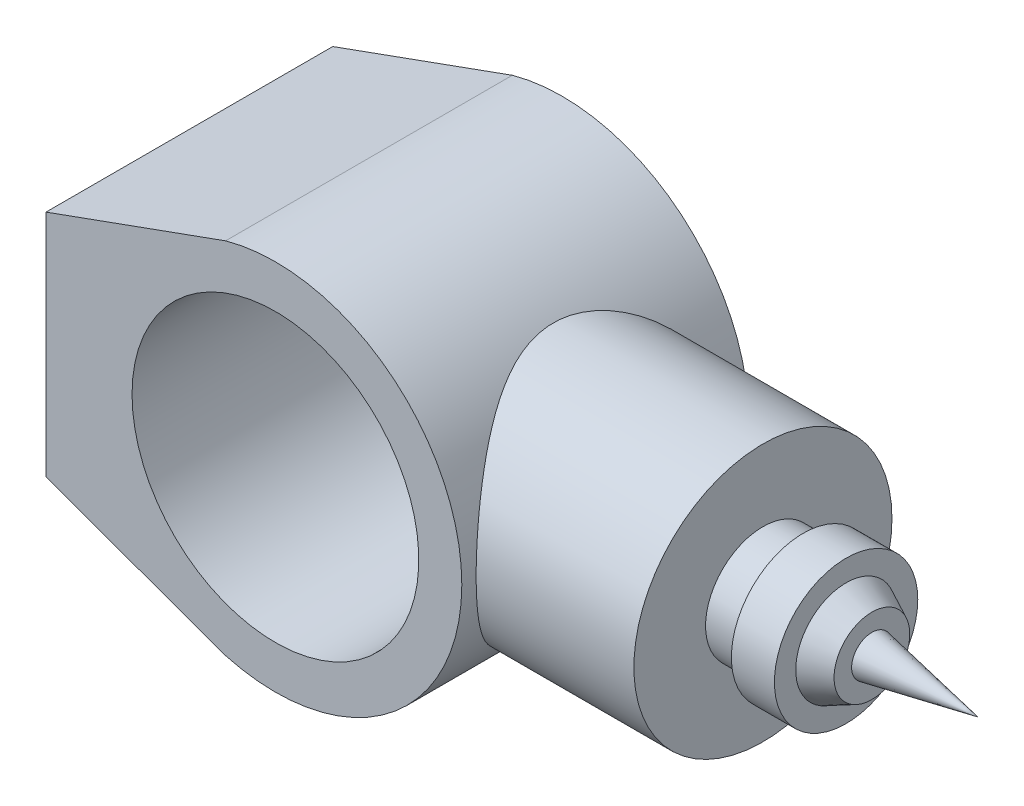
ISO-10303-21;
HEADER;
FILE_DESCRIPTION(('STEP AP214'),'2;1');
FILE_NAME('part.step','',(''),(''),'','','');
FILE_SCHEMA(('AUTOMOTIVE_DESIGN { 1 0 10303 214 1 1 1 1 }'));
ENDSEC;
DATA;
#1=APPLICATION_CONTEXT('core data for automotive mechanical design processes');
#2=APPLICATION_PROTOCOL_DEFINITION('international standard','automotive_design',2000,#1);
#3=PRODUCT_CONTEXT('',#1,'mechanical');
#4=PRODUCT('Part','Part','',(#3));
#5=PRODUCT_RELATED_PRODUCT_CATEGORY('part','',(#4));
#6=PRODUCT_DEFINITION_FORMATION('','',#4);
#7=PRODUCT_DEFINITION_CONTEXT('part definition',#1,'design');
#8=PRODUCT_DEFINITION('design','',#6,#7);
#9=PRODUCT_DEFINITION_SHAPE('','',#8);
#10=(LENGTH_UNIT() NAMED_UNIT(*) SI_UNIT(.MILLI.,.METRE.));
#11=(NAMED_UNIT(*) PLANE_ANGLE_UNIT() SI_UNIT($,.RADIAN.));
#12=(NAMED_UNIT(*) SI_UNIT($,.STERADIAN.) SOLID_ANGLE_UNIT());
#13=UNCERTAINTY_MEASURE_WITH_UNIT(LENGTH_MEASURE(1.E-05),#10,'distance_accuracy_value','');
#14=(GEOMETRIC_REPRESENTATION_CONTEXT(3) GLOBAL_UNCERTAINTY_ASSIGNED_CONTEXT((#13)) GLOBAL_UNIT_ASSIGNED_CONTEXT((#10,
#11,#12)) REPRESENTATION_CONTEXT('',''));
#15=CARTESIAN_POINT('',(0.,0.,0.));
#16=DIRECTION('',(0.,0.,1.));
#17=DIRECTION('',(1.,0.,0.));
#18=AXIS2_PLACEMENT_3D('',#15,#16,#17);
#19=CARTESIAN_POINT('',(0.,0.,50.));
#20=DIRECTION('',(0.,0.,1.));
#21=DIRECTION('',(1.,0.,0.));
#22=AXIS2_PLACEMENT_3D('',#19,#20,#21);
#23=PLANE('',#22);
#24=CARTESIAN_POINT('',(0.,0.,50.));
#25=DIRECTION('',(0.,0.,1.));
#26=DIRECTION('',(1.,0.,0.));
#27=AXIS2_PLACEMENT_3D('',#24,#25,#26);
#28=CIRCLE('',#27,65.);
#29=CARTESIAN_POINT('',(-17.3680727843723,-62.6366509941004,50.));
#30=VERTEX_POINT('',#29);
#31=CARTESIAN_POINT('',(-17.3680727843723,62.6366509941004,50.));
#32=VERTEX_POINT('',#31);
#33=EDGE_CURVE('E208',#30,#32,#28,.T.);
#34=ORIENTED_EDGE('',*,*,#33,.T.);
#35=DIRECTION('',(-0.940460008541162,-0.339904357628374,0.));
#36=VECTOR('',#35,1.);
#37=CARTESIAN_POINT('',(-80.,40.,50.));
#38=LINE('',#37,#36);
#39=CARTESIAN_POINT('',(-80.,40.,50.));
#40=VERTEX_POINT('',#39);
#41=EDGE_CURVE('E97',#32,#40,#38,.T.);
#42=ORIENTED_EDGE('',*,*,#41,.T.);
#43=DIRECTION('',(0.,-1.,0.));
#44=VECTOR('',#43,1.);
#45=CARTESIAN_POINT('',(-80.,-40.,50.));
#46=LINE('',#45,#44);
#47=CARTESIAN_POINT('',(-80.,-40.,50.));
#48=VERTEX_POINT('',#47);
#49=EDGE_CURVE('E204',#40,#48,#46,.T.);
#50=ORIENTED_EDGE('',*,*,#49,.T.);
#51=DIRECTION('',(0.940460008541162,-0.339904357628374,0.));
#52=VECTOR('',#51,1.);
#53=CARTESIAN_POINT('',(-80.,-40.,50.));
#54=LINE('',#53,#52);
#55=EDGE_CURVE('E65',#48,#30,#54,.T.);
#56=ORIENTED_EDGE('',*,*,#55,.T.);
#57=EDGE_LOOP('',(#34,#42,#50,#56));
#58=FACE_BOUND('',#57,.T.);
#59=CARTESIAN_POINT('',(0.,0.,50.));
#60=DIRECTION('',(0.,0.,1.));
#61=DIRECTION('',(1.,0.,0.));
#62=AXIS2_PLACEMENT_3D('',#59,#60,#61);
#63=CIRCLE('',#62,50.);
#64=CARTESIAN_POINT('',(-50.,0.,50.));
#65=VERTEX_POINT('',#64);
#66=EDGE_CURVE('E139',#65,#65,#63,.T.);
#67=ORIENTED_EDGE('',*,*,#66,.F.);
#68=EDGE_LOOP('',(#67));
#69=FACE_BOUND('',#68,.T.);
#70=ADVANCED_FACE('F47',(#58,#69),#23,.T.);
#71=CARTESIAN_POINT('',(0.,0.,-50.));
#72=DIRECTION('',(0.,0.,1.));
#73=DIRECTION('',(1.,0.,0.));
#74=AXIS2_PLACEMENT_3D('',#71,#72,#73);
#75=PLANE('',#74);
#76=CARTESIAN_POINT('',(0.,0.,-50.));
#77=DIRECTION('',(0.,0.,1.));
#78=DIRECTION('',(1.,0.,0.));
#79=AXIS2_PLACEMENT_3D('',#76,#77,#78);
#80=CIRCLE('',#79,65.);
#81=CARTESIAN_POINT('',(-17.3680727843723,-62.6366509941004,-50.));
#82=VERTEX_POINT('',#81);
#83=CARTESIAN_POINT('',(-17.3680727843723,62.6366509941004,-50.));
#84=VERTEX_POINT('',#83);
#85=EDGE_CURVE('E202',#82,#84,#80,.T.);
#86=ORIENTED_EDGE('',*,*,#85,.F.);
#87=DIRECTION('',(0.940460008541162,-0.339904357628374,0.));
#88=VECTOR('',#87,1.);
#89=CARTESIAN_POINT('',(-80.,-40.,-50.));
#90=LINE('',#89,#88);
#91=CARTESIAN_POINT('',(-80.,-40.,-50.));
#92=VERTEX_POINT('',#91);
#93=EDGE_CURVE('E89',#92,#82,#90,.T.);
#94=ORIENTED_EDGE('',*,*,#93,.F.);
#95=DIRECTION('',(0.,-1.,0.));
#96=VECTOR('',#95,1.);
#97=CARTESIAN_POINT('',(-80.,-40.,-50.));
#98=LINE('',#97,#96);
#99=CARTESIAN_POINT('',(-80.,40.,-50.));
#100=VERTEX_POINT('',#99);
#101=EDGE_CURVE('E83',#100,#92,#98,.T.);
#102=ORIENTED_EDGE('',*,*,#101,.F.);
#103=DIRECTION('',(-0.940460008541162,-0.339904357628374,0.));
#104=VECTOR('',#103,1.);
#105=CARTESIAN_POINT('',(-80.,40.,-50.));
#106=LINE('',#105,#104);
#107=EDGE_CURVE('E196',#84,#100,#106,.T.);
#108=ORIENTED_EDGE('',*,*,#107,.F.);
#109=EDGE_LOOP('',(#86,#94,#102,#108));
#110=FACE_BOUND('',#109,.T.);
#111=CARTESIAN_POINT('',(0.,0.,-50.));
#112=DIRECTION('',(0.,0.,1.));
#113=DIRECTION('',(1.,0.,0.));
#114=AXIS2_PLACEMENT_3D('',#111,#112,#113);
#115=CIRCLE('',#114,50.);
#116=CARTESIAN_POINT('',(-50.,0.,-50.));
#117=VERTEX_POINT('',#116);
#118=EDGE_CURVE('E131',#117,#117,#115,.T.);
#119=ORIENTED_EDGE('',*,*,#118,.T.);
#120=EDGE_LOOP('',(#119));
#121=FACE_BOUND('',#120,.T.);
#122=ADVANCED_FACE('F176',(#110,#121),#75,.F.);
#123=CARTESIAN_POINT('',(0.,0.,50.));
#124=DIRECTION('',(0.,0.,-1.));
#125=DIRECTION('',(-1.,0.,0.));
#126=AXIS2_PLACEMENT_3D('',#123,#124,#125);
#127=CYLINDRICAL_SURFACE('',#126,65.);
#128=CARTESIAN_POINT('',(65.,0.,-45.));
#129=CARTESIAN_POINT('',(65.0000011696057,1.12147330120565,-45.0000012025283));
#130=CARTESIAN_POINT('',(64.9709159765213,2.24292945230778,-44.9580201602482));
#131=CARTESIAN_POINT('',(64.8553068641383,4.47658414079082,-44.790785609369));
#132=CARTESIAN_POINT('',(64.7687842573088,5.58878288911931,-44.6655340035371));
#133=CARTESIAN_POINT('',(64.5403785763001,7.79555151848627,-44.3336771879691));
#134=CARTESIAN_POINT('',(64.3984760503456,8.8901150644775,-44.1270433931238));
#135=CARTESIAN_POINT('',(64.0626457436966,11.0533096019768,-43.6354760134034));
#136=CARTESIAN_POINT('',(63.8687169569864,12.1219400915896,-43.3505409144375));
#137=CARTESIAN_POINT('',(63.4342222744662,14.2212125160505,-42.7078017297046));
#138=CARTESIAN_POINT('',(63.1938918545645,15.2520162370063,-42.3503651251477));
#139=CARTESIAN_POINT('',(62.6709259446924,17.2756280115286,-41.5659763086892));
#140=CARTESIAN_POINT('',(62.3882907364915,18.268436318107,-41.1390245597888));
#141=CARTESIAN_POINT('',(61.786108553932,20.2116697228795,-40.2199419970838));
#142=CARTESIAN_POINT('',(61.4665619062631,21.1620951960855,-39.7278117601444));
#143=CARTESIAN_POINT('',(60.7962171584065,23.0172309124314,-38.6825647509799));
#144=CARTESIAN_POINT('',(60.4454175300334,23.9219389167185,-38.1294449962195));
#145=CARTESIAN_POINT('',(59.6865648974474,25.7601880140228,-36.9151737617935));
#146=CARTESIAN_POINT('',(59.27618815402,26.6893215363404,-36.2488040005491));
#147=CARTESIAN_POINT('',(58.4330275057249,28.4880338622967,-34.8529502059224));
#148=CARTESIAN_POINT('',(58.0002425478181,29.3576098626539,-34.1234632053608));
#149=CARTESIAN_POINT('',(57.1195111836477,31.0364486388513,-32.6040251352403));
#150=CARTESIAN_POINT('',(56.6715447181891,31.8456267033451,-31.8139921794123));
#151=CARTESIAN_POINT('',(55.7691986061138,33.4006700551814,-30.1773036556993));
#152=CARTESIAN_POINT('',(55.3148185876119,34.1465316534289,-29.3306447936721));
#153=CARTESIAN_POINT('',(54.3303114345595,35.6959084068904,-27.4326466159468));
#154=CARTESIAN_POINT('',(53.8005937511269,36.4872853280241,-26.3711450656527));
#155=CARTESIAN_POINT('',(52.7593327891933,37.977350950991,-24.17604025639));
#156=CARTESIAN_POINT('',(52.2477941160227,38.6760162868262,-23.0424189272517));
#157=CARTESIAN_POINT('',(51.2608149265043,39.9749077721744,-20.7072341856928));
#158=CARTESIAN_POINT('',(50.7853275075273,40.5752630453964,-19.5057627267967));
#159=CARTESIAN_POINT('',(49.8892399163793,41.6721166930025,-17.0369318640641));
#160=CARTESIAN_POINT('',(49.4686114171659,42.1686687478853,-15.7696069409943));
#161=CARTESIAN_POINT('',(48.8208029416879,42.9149535309565,-13.5723996352816));
#162=CARTESIAN_POINT('',(48.5738420263558,43.1936925213245,-12.6581208440976));
#163=CARTESIAN_POINT('',(48.1238801744123,43.6944569649788,-10.8035389223551));
#164=CARTESIAN_POINT('',(47.9208721021929,43.9164916250901,-9.86324004407422));
#165=CARTESIAN_POINT('',(47.5660754926548,44.3005296261305,-7.96250438663412));
#166=CARTESIAN_POINT('',(47.4142038087044,44.4626304606427,-7.0021030214949));
#167=CARTESIAN_POINT('',(47.1671263845177,44.7246555122386,-5.0655405262852));
#168=CARTESIAN_POINT('',(47.0719206259529,44.824579749433,-4.08937940131227));
#169=CARTESIAN_POINT('',(46.9418899090943,44.9607388198673,-2.12323648479673));
#170=CARTESIAN_POINT('',(46.9073939345417,44.9966266570423,-1.13320851844661));
#171=CARTESIAN_POINT('',(46.9013571135476,45.0029190462422,0.847248377093815));
#172=CARTESIAN_POINT('',(46.9298161498631,44.9733237202183,1.83767730553397));
#173=CARTESIAN_POINT('',(47.0484302849821,44.8492190899201,3.81128752429079));
#174=CARTESIAN_POINT('',(47.1386230552101,44.7546701492421,4.79446401850659));
#175=CARTESIAN_POINT('',(47.3768313176079,44.5024241630868,6.74551496467454));
#176=CARTESIAN_POINT('',(47.5248480621437,44.3447257499009,7.71338908473166));
#177=CARTESIAN_POINT('',(47.8621764271841,43.9803320764262,9.56919366964683));
#178=CARTESIAN_POINT('',(48.0484149088864,43.7772163066585,10.4583970625519));
#179=CARTESIAN_POINT('',(48.4609441046406,43.32010640119,12.2144143492181));
#180=CARTESIAN_POINT('',(48.6872496045115,43.0660934784815,13.0812198417583));
#181=CARTESIAN_POINT('',(49.1738509640383,42.5096331932465,14.7898225666927));
#182=CARTESIAN_POINT('',(49.4341648638834,42.2071601049958,15.6316062329481));
#183=CARTESIAN_POINT('',(49.9825182796335,41.5563350032134,17.2876417419013));
#184=CARTESIAN_POINT('',(50.2705534011697,41.2079902580444,18.1018979206948));
#185=CARTESIAN_POINT('',(51.0225431471345,40.2767822129268,20.1137766396802));
#186=CARTESIAN_POINT('',(51.5007434523328,39.6654891440572,21.2930273345177));
#187=CARTESIAN_POINT('',(52.4891158781477,38.348029920852,23.5833678403921));
#188=CARTESIAN_POINT('',(52.9993005340588,37.6418264436726,24.6944305853524));
#189=CARTESIAN_POINT('',(54.0361557973494,36.1376496350166,26.8476775780095));
#190=CARTESIAN_POINT('',(54.5628535785461,35.3395185623559,27.8897384505711));
#191=CARTESIAN_POINT('',(55.6171804467178,33.6558443419671,29.8998791095632));
#192=CARTESIAN_POINT('',(56.1448094104418,32.7703120184234,30.8679680307498));
#193=CARTESIAN_POINT('',(57.1932449701135,30.9045304086319,32.7363921475659));
#194=CARTESIAN_POINT('',(57.7139191350982,29.9233731295192,33.6358963165067));
#195=CARTESIAN_POINT('',(58.7296419536465,27.8771206485979,35.350355349792));
#196=CARTESIAN_POINT('',(59.2246882700661,26.8120178135979,36.1653025097018));
#197=CARTESIAN_POINT('',(60.1756566955639,24.6035209522421,37.7024332048813));
#198=CARTESIAN_POINT('',(60.6316475651595,23.4602711709794,38.4247809320632));
#199=CARTESIAN_POINT('',(61.4931891608211,21.0989507187335,39.7703323765769));
#200=CARTESIAN_POINT('',(61.898755017873,19.8809026570889,40.3935658507715));
#201=CARTESIAN_POINT('',(62.5646802947783,17.6549035875762,41.4059204565395));
#202=CARTESIAN_POINT('',(62.8372982548467,16.6602403417733,41.8163120535009));
#203=CARTESIAN_POINT('',(63.3397164077328,14.6345031625144,42.5675669112335));
#204=CARTESIAN_POINT('',(63.569522535998,13.603434299959,42.9084398107234));
#205=CARTESIAN_POINT('',(63.9815049902596,11.5110112910016,43.5164676119118));
#206=CARTESIAN_POINT('',(64.1637052650743,10.4496726714622,43.7836595836378));
#207=CARTESIAN_POINT('',(64.476639865795,8.30296993183374,44.2409869387356));
#208=CARTESIAN_POINT('',(64.6073730982257,7.21760530180256,44.431120684921));
#209=CARTESIAN_POINT('',(64.8147345736682,5.02649787175023,44.7321113931983));
#210=CARTESIAN_POINT('',(64.8911534961694,3.92069290489762,44.8426616714377));
#211=CARTESIAN_POINT('',(64.9872183357685,1.70145350776207,44.981563734156));
#212=CARTESIAN_POINT('',(65.0068642771874,0.58801908074768,45.0099155538474));
#213=CARTESIAN_POINT('',(64.9889001241945,-1.63741781931567,44.9839662509349));
#214=CARTESIAN_POINT('',(64.9512898349751,-2.74942028747967,44.929664847113));
#215=CARTESIAN_POINT('',(64.819734418053,-4.96298947367602,44.7392747901952));
#216=CARTESIAN_POINT('',(64.7257910494465,-6.06455651648126,44.6031886909653));
#217=CARTESIAN_POINT('',(64.491175703309,-8.18254449212148,44.2620157992034));
#218=CARTESIAN_POINT('',(64.3536808680178,-9.20007959997773,44.0616107864454));
#219=CARTESIAN_POINT('',(64.0337856060908,-11.2121337136589,43.593061351668));
#220=CARTESIAN_POINT('',(63.8513873855499,-12.2066538475799,43.3249202574929));
#221=CARTESIAN_POINT('',(63.4451725249075,-14.1673074608522,42.7239854011605));
#222=CARTESIAN_POINT('',(63.2213525684632,-15.1334386601222,42.3911864622048));
#223=CARTESIAN_POINT('',(62.7363363526771,-17.0327019487273,41.6643868113869));
#224=CARTESIAN_POINT('',(62.4751380044848,-17.965832190203,41.2703826790343));
#225=CARTESIAN_POINT('',(61.8990085085122,-19.8637431772395,40.3931275129008));
#226=CARTESIAN_POINT('',(61.5815209528501,-20.8256806929253,39.9054081529014));
#227=CARTESIAN_POINT('',(60.9142086391395,-22.7035764997345,38.8677076181211));
#228=CARTESIAN_POINT('',(60.5643826081083,-23.6195329786528,38.3177239921568));
#229=CARTESIAN_POINT('',(59.8381347129401,-25.4032558353403,37.1592008079418));
#230=CARTESIAN_POINT('',(59.4616987975441,-26.270996314329,36.5506302507532));
#231=CARTESIAN_POINT('',(58.6884577670336,-27.9557544991496,35.2787474176625));
#232=CARTESIAN_POINT('',(58.2916515549571,-28.7727694681138,34.615432192531));
#233=CARTESIAN_POINT('',(57.4151711853793,-30.4889708749912,33.1199200847161));
#234=CARTESIAN_POINT('',(56.9328754552547,-31.3785212006928,32.2781812569548));
#235=CARTESIAN_POINT('',(55.9590893109094,-33.0839042215169,30.527835244559));
#236=CARTESIAN_POINT('',(55.4675975421249,-33.8997259516808,29.61921815009));
#237=CARTESIAN_POINT('',(54.4860350387397,-35.45586994741,27.7375714933992));
#238=CARTESIAN_POINT('',(53.9959654596117,-36.1961418986443,26.7644997080007));
#239=CARTESIAN_POINT('',(53.0294834997435,-37.5978502361011,24.7568233036382));
#240=CARTESIAN_POINT('',(52.553069328415,-38.2592969946585,23.7222268074148));
#241=CARTESIAN_POINT('',(51.679941347726,-39.4291013564639,21.7149007388747));
#242=CARTESIAN_POINT('',(51.2803372484816,-39.9463152685162,20.7485884228094));
#243=CARTESIAN_POINT('',(50.5123974548912,-40.913063666173,18.7705314851885));
#244=CARTESIAN_POINT('',(50.1440619804653,-41.3625976757848,17.7587865441704));
#245=CARTESIAN_POINT('',(49.4504928922364,-42.189330129269,15.693797265063));
#246=CARTESIAN_POINT('',(49.1251906412472,-42.566644202947,14.6406225749502));
#247=CARTESIAN_POINT('',(48.5290098021012,-43.2451098617227,12.4950157035289));
#248=CARTESIAN_POINT('',(48.2581179989952,-43.5462799449171,11.4025931307277));
#249=CARTESIAN_POINT('',(47.8271610412375,-44.018687486118,9.39216299943509));
#250=CARTESIAN_POINT('',(47.6558419905218,-44.2036946073207,8.47979353570418));
#251=CARTESIAN_POINT('',(47.3627606953031,-44.517583244497,6.63757582668244));
#252=CARTESIAN_POINT('',(47.2409923142224,-44.6464717105955,5.70772976070372));
#253=CARTESIAN_POINT('',(47.05166615705,-44.8459556683364,3.83718735816971));
#254=CARTESIAN_POINT('',(46.9840561376509,-44.9166073394187,2.89650236820513));
#255=CARTESIAN_POINT('',(46.9055698265682,-44.9985645522097,1.01014116515034));
#256=CARTESIAN_POINT('',(46.8946943314281,-45.0098692606967,0.0644648821697801));
#257=CARTESIAN_POINT('',(46.9301408777119,-44.972908524549,-1.82506201386805));
#258=CARTESIAN_POINT('',(46.9764888551696,-44.9246160680299,-2.76891160474201));
#259=CARTESIAN_POINT('',(47.1245232303033,-44.7693052695385,-4.64731891289863));
#260=CARTESIAN_POINT('',(47.226209296244,-44.6622872796082,-5.58187668584875));
#261=CARTESIAN_POINT('',(47.4811423262629,-44.3911660407895,-7.43666598606561));
#262=CARTESIAN_POINT('',(47.634452919394,-44.2269923369625,-8.35687836049679));
#263=CARTESIAN_POINT('',(47.9871889035597,-43.8440109221367,-10.1768310643423));
#264=CARTESIAN_POINT('',(48.1866204648689,-43.6251959006593,-11.0765686368372));
#265=CARTESIAN_POINT('',(48.6908782922366,-43.0625185245671,-13.116726178063));
#266=CARTESIAN_POINT('',(49.0093972350599,-42.7008255731353,-14.2488681052183));
#267=CARTESIAN_POINT('',(49.699554494161,-41.8955268796886,-16.4668795226373));
#268=CARTESIAN_POINT('',(50.0712093704162,-41.4518955887103,-17.5527344499461));
#269=CARTESIAN_POINT('',(50.8544123719762,-40.4872212981013,-19.6760329984318));
#270=CARTESIAN_POINT('',(51.2660067549033,-39.9660881554129,-20.7134183727638));
#271=CARTESIAN_POINT('',(52.116211879306,-38.8508952329155,-22.7363587217865));
#272=CARTESIAN_POINT('',(52.5548209260535,-38.2568400254561,-23.7219169406072));
#273=CARTESIAN_POINT('',(53.4579357785502,-36.9847423381263,-25.6613286822633));
#274=CARTESIAN_POINT('',(53.9228021101371,-36.3051118639051,-26.6139712103077));
#275=CARTESIAN_POINT('',(54.8583333343946,-34.8753950985048,-28.4617532840731));
#276=CARTESIAN_POINT('',(55.3289982185488,-34.1253089107936,-29.3568929142368));
#277=CARTESIAN_POINT('',(56.2664339133503,-32.5564691651912,-31.0876310121466));
#278=CARTESIAN_POINT('',(56.733203509343,-31.7376950080828,-31.923211478402));
#279=CARTESIAN_POINT('',(57.6535165855435,-30.0334816520249,-33.5315189390535));
#280=CARTESIAN_POINT('',(58.1070588196762,-29.1480362003111,-34.3042400240122));
#281=CARTESIAN_POINT('',(59.0635284336244,-27.1643113596245,-35.9022819462667));
#282=CARTESIAN_POINT('',(59.5626106290919,-26.0547472869609,-36.7159606163357));
#283=CARTESIAN_POINT('',(60.5176757229357,-23.7521280348397,-38.2458641369291));
#284=CARTESIAN_POINT('',(60.9736519283074,-22.5590599397197,-38.962073861155));
#285=CARTESIAN_POINT('',(61.6149926579414,-20.712734812731,-39.9558623322098));
#286=CARTESIAN_POINT('',(61.8215919655179,-20.0881105839989,-40.2735888165198));
#287=CARTESIAN_POINT('',(62.2191547005857,-18.8206694867555,-40.8812436548858));
#288=CARTESIAN_POINT('',(62.4101203779566,-18.1778552539996,-41.1711760099035));
#289=CARTESIAN_POINT('',(62.7748527233683,-16.8752831176649,-41.7219931318357));
#290=CARTESIAN_POINT('',(62.9486230408552,-16.2155288469421,-41.9828840638124));
#291=CARTESIAN_POINT('',(63.2775356475737,-14.8804011558233,-42.4744610119283));
#292=CARTESIAN_POINT('',(63.432679284421,-14.2050288695917,-42.7051492133046));
#293=CARTESIAN_POINT('',(63.8070721968101,-12.4447010544915,-43.25974494481));
#294=CARTESIAN_POINT('',(64.0114184468014,-11.3490405228654,-43.5602757498286));
#295=CARTESIAN_POINT('',(64.3654191982087,-9.12991345978798,-44.0788276443961));
#296=CARTESIAN_POINT('',(64.5150820049425,-8.00645117856253,-44.2968612637911));
#297=CARTESIAN_POINT('',(64.7559993187061,-5.74082253729109,-44.6470112993716));
#298=CARTESIAN_POINT('',(64.847297757104,-4.59867091062171,-44.7791923387443));
#299=CARTESIAN_POINT('',(64.9692976296881,-2.30434018473195,-44.9556862638234));
#300=CARTESIAN_POINT('',(64.9999987983896,-1.15216104160189,-44.999998764566));
#301=CARTESIAN_POINT('',(65.,0.,-45.));
#302=B_SPLINE_CURVE_WITH_KNOTS('',3,(#128,#129,#130,#131,#132,#133,#134,#135,#136,#137,#138,
#139,#140,#141,#142,#143,#144,#145,#146,#147,#148,#149,#150,#151,#152,#153,#154,#155,#156,#157,
#158,#159,#160,#161,#162,#163,#164,#165,#166,#167,#168,#169,#170,#171,#172,#173,#174,#175,#176,
#177,#178,#179,#180,#181,#182,#183,#184,#185,#186,#187,#188,#189,#190,#191,#192,#193,#194,#195,
#196,#197,#198,#199,#200,#201,#202,#203,#204,#205,#206,#207,#208,#209,#210,#211,#212,#213,#214,
#215,#216,#217,#218,#219,#220,#221,#222,#223,#224,#225,#226,#227,#228,#229,#230,#231,#232,#233,
#234,#235,#236,#237,#238,#239,#240,#241,#242,#243,#244,#245,#246,#247,#248,#249,#250,#251,#252,
#253,#254,#255,#256,#257,#258,#259,#260,#261,#262,#263,#264,#265,#266,#267,#268,#269,#270,#271,
#272,#273,#274,#275,#276,#277,#278,#279,#280,#281,#282,#283,#284,#285,#286,#287,#288,#289,#290,
#291,#292,#293,#294,#295,#296,#297,#298,#299,#300,#301),.UNSPECIFIED.,.T.,.F.,(4,2,2,2,2,2,2,2,
2,2,2,2,2,2,2,2,2,2,2,2,2,2,2,2,2,2,2,2,2,2,2,2,2,2,2,2,2,2,2,2,2,2,2,2,2,2,2,2,2,2,2,2,2,2,2,2,
2,2,2,2,2,2,2,2,2,2,2,2,2,2,2,2,2,2,2,2,2,2,2,2,2,2,2,2,2,2,4),(0.,3.36323892794143,
6.72640100710136,10.0907454360665,13.4551549250109,16.8029195613731,20.1506619010729,
23.4983746134034,26.8462511096753,30.4871649037346,34.1282499524345,37.7743494260164,
41.4206611917408,45.6939383064405,49.9682903731881,54.2369825353392,58.5034617073671,
61.4625138492405,64.4210852373372,67.3748225577202,70.3285589227263,73.2982527376573,
76.2679410220407,79.2394430998938,82.2110095388412,85.0011411726389,87.7923045951578,
90.584954683776,93.3771628083065,97.6064034875675,101.837312178738,106.075592113262,
110.313347816192,114.596218662803,118.879479402292,123.155037051935,127.429308626693,
130.755998382163,134.082226580387,137.406778235214,140.731400520075,144.068767009318,
147.406132068879,150.743508483461,154.080780688208,157.215791533369,160.35064838675,
163.485756334407,166.621039552604,169.990545063149,173.360183268584,176.73161428665,
180.103227050672,184.047902440152,187.993163521895,191.94103513809,195.888386692538,
199.385185586645,202.88200907258,206.373186157812,209.863514294626,212.700365177753,
215.536864625513,218.370624567028,221.204424293963,224.039508887241,226.874576485218,
229.713151272815,232.55210603787,236.23803941247,239.925124033801,243.616531168718,
247.307706963636,251.081871120678,254.856029735252,258.631324277359,262.406973327354,
266.792058434818,271.177823293658,273.368885604935,275.55963203795,277.749912517597,
279.940034437727,283.398420446896,286.856280978073,290.31153567335,293.766805506531),.UNSPECIFIED.);
#303=CARTESIAN_POINT('',(65.,0.,-45.));
#304=VERTEX_POINT('',#303);
#305=EDGE_CURVE('E126',#304,#304,#302,.T.);
#306=ORIENTED_EDGE('',*,*,#305,.F.);
#307=EDGE_LOOP('',(#306));
#308=FACE_BOUND('',#307,.T.);
#309=ORIENTED_EDGE('',*,*,#85,.T.);
#310=DIRECTION('',(0.,0.,-1.));
#311=VECTOR('',#310,1.);
#312=CARTESIAN_POINT('',(-17.3680727843723,62.6366509941004,50.));
#313=LINE('',#312,#311);
#314=EDGE_CURVE('E51',#32,#84,#313,.T.);
#315=ORIENTED_EDGE('',*,*,#314,.F.);
#316=ORIENTED_EDGE('',*,*,#33,.F.);
#317=DIRECTION('',(0.,0.,-1.));
#318=VECTOR('',#317,1.);
#319=CARTESIAN_POINT('',(-17.3680727843723,-62.6366509941004,50.));
#320=LINE('',#319,#318);
#321=EDGE_CURVE('E212',#30,#82,#320,.T.);
#322=ORIENTED_EDGE('',*,*,#321,.T.);
#323=EDGE_LOOP('',(#309,#315,#316,#322));
#324=FACE_BOUND('',#323,.T.);
#325=ADVANCED_FACE('F49',(#308,#324),#127,.T.);
#326=CARTESIAN_POINT('',(-80.,40.,50.));
#327=DIRECTION('',(0.339904357628374,-0.940460008541162,0.));
#328=DIRECTION('',(0.940460008541162,0.339904357628374,0.));
#329=AXIS2_PLACEMENT_3D('',#326,#327,#328);
#330=PLANE('',#329);
#331=ORIENTED_EDGE('',*,*,#107,.T.);
#332=DIRECTION('',(0.,0.,-1.));
#333=VECTOR('',#332,1.);
#334=CARTESIAN_POINT('',(-80.,40.,50.));
#335=LINE('',#334,#333);
#336=EDGE_CURVE('E197',#40,#100,#335,.T.);
#337=ORIENTED_EDGE('',*,*,#336,.F.);
#338=ORIENTED_EDGE('',*,*,#41,.F.);
#339=ORIENTED_EDGE('',*,*,#314,.T.);
#340=EDGE_LOOP('',(#331,#337,#338,#339));
#341=FACE_BOUND('',#340,.T.);
#342=ADVANCED_FACE('F190',(#341),#330,.F.);
#343=CARTESIAN_POINT('',(-80.,-40.,50.));
#344=DIRECTION('',(1.,0.,0.));
#345=DIRECTION('',(0.,0.,-1.));
#346=AXIS2_PLACEMENT_3D('',#343,#344,#345);
#347=PLANE('',#346);
#348=ORIENTED_EDGE('',*,*,#101,.T.);
#349=DIRECTION('',(0.,0.,-1.));
#350=VECTOR('',#349,1.);
#351=CARTESIAN_POINT('',(-80.,-40.,50.));
#352=LINE('',#351,#350);
#353=EDGE_CURVE('E205',#48,#92,#352,.T.);
#354=ORIENTED_EDGE('',*,*,#353,.F.);
#355=ORIENTED_EDGE('',*,*,#49,.F.);
#356=ORIENTED_EDGE('',*,*,#336,.T.);
#357=EDGE_LOOP('',(#348,#354,#355,#356));
#358=FACE_BOUND('',#357,.T.);
#359=ADVANCED_FACE('F188',(#358),#347,.F.);
#360=CARTESIAN_POINT('',(-80.,-40.,50.));
#361=DIRECTION('',(0.339904357628374,0.940460008541162,0.));
#362=DIRECTION('',(-0.940460008541162,0.339904357628374,0.));
#363=AXIS2_PLACEMENT_3D('',#360,#361,#362);
#364=PLANE('',#363);
#365=ORIENTED_EDGE('',*,*,#93,.T.);
#366=ORIENTED_EDGE('',*,*,#321,.F.);
#367=ORIENTED_EDGE('',*,*,#55,.F.);
#368=ORIENTED_EDGE('',*,*,#353,.T.);
#369=EDGE_LOOP('',(#365,#366,#367,#368));
#370=FACE_BOUND('',#369,.T.);
#371=ADVANCED_FACE('F185',(#370),#364,.F.);
#372=CARTESIAN_POINT('',(0.,0.,50.));
#373=DIRECTION('',(0.,0.,-1.));
#374=DIRECTION('',(-1.,0.,0.));
#375=AXIS2_PLACEMENT_3D('',#372,#373,#374);
#376=CYLINDRICAL_SURFACE('',#375,50.);
#377=CARTESIAN_POINT('',(-50.,0.,50.));
#378=CARTESIAN_POINT('',(-50.,0.,48.9583333333333));
#379=CARTESIAN_POINT('',(-50.,0.,47.9166666666667));
#380=CARTESIAN_POINT('',(-50.,0.,45.8333333333333));
#381=CARTESIAN_POINT('',(-50.,0.,44.7916666666667));
#382=CARTESIAN_POINT('',(-50.,0.,42.7083333333333));
#383=CARTESIAN_POINT('',(-50.,0.,41.6666666666667));
#384=CARTESIAN_POINT('',(-50.,0.,39.5833333333333));
#385=CARTESIAN_POINT('',(-50.,0.,38.5416666666667));
#386=CARTESIAN_POINT('',(-50.,0.,36.4583333333333));
#387=CARTESIAN_POINT('',(-50.,0.,35.4166666666667));
#388=CARTESIAN_POINT('',(-50.,0.,33.3333333333333));
#389=CARTESIAN_POINT('',(-50.,0.,32.2916666666667));
#390=CARTESIAN_POINT('',(-50.,0.,30.2083333333333));
#391=CARTESIAN_POINT('',(-50.,0.,29.1666666666667));
#392=CARTESIAN_POINT('',(-50.,0.,27.0833333333333));
#393=CARTESIAN_POINT('',(-50.,0.,26.0416666666667));
#394=CARTESIAN_POINT('',(-50.,0.,23.9583333333333));
#395=CARTESIAN_POINT('',(-50.,0.,22.9166666666667));
#396=CARTESIAN_POINT('',(-50.,0.,20.8333333333333));
#397=CARTESIAN_POINT('',(-50.,0.,19.7916666666667));
#398=CARTESIAN_POINT('',(-50.,0.,17.7083333333333));
#399=CARTESIAN_POINT('',(-50.,0.,16.6666666666667));
#400=CARTESIAN_POINT('',(-50.,0.,14.5833333333333));
#401=CARTESIAN_POINT('',(-50.,0.,13.5416666666667));
#402=CARTESIAN_POINT('',(-50.,0.,11.4583333333333));
#403=CARTESIAN_POINT('',(-50.,0.,10.4166666666667));
#404=CARTESIAN_POINT('',(-50.,0.,8.33333333333333));
#405=CARTESIAN_POINT('',(-50.,0.,7.29166666666666));
#406=CARTESIAN_POINT('',(-50.,0.,5.20833333333333));
#407=CARTESIAN_POINT('',(-50.,0.,4.16666666666666));
#408=CARTESIAN_POINT('',(-50.,0.,2.08333333333333));
#409=CARTESIAN_POINT('',(-50.,0.,1.04166666666666));
#410=CARTESIAN_POINT('',(-50.,0.,-1.04166666666667));
#411=CARTESIAN_POINT('',(-50.,0.,-2.08333333333334));
#412=CARTESIAN_POINT('',(-50.,0.,-4.16666666666667));
#413=CARTESIAN_POINT('',(-50.,0.,-5.20833333333334));
#414=CARTESIAN_POINT('',(-50.,0.,-7.29166666666667));
#415=CARTESIAN_POINT('',(-50.,0.,-8.33333333333334));
#416=CARTESIAN_POINT('',(-50.,0.,-10.4166666666667));
#417=CARTESIAN_POINT('',(-50.,0.,-11.4583333333333));
#418=CARTESIAN_POINT('',(-50.,0.,-13.5416666666667));
#419=CARTESIAN_POINT('',(-50.,0.,-14.5833333333333));
#420=CARTESIAN_POINT('',(-50.,0.,-16.6666666666667));
#421=CARTESIAN_POINT('',(-50.,0.,-17.7083333333333));
#422=CARTESIAN_POINT('',(-50.,0.,-19.7916666666667));
#423=CARTESIAN_POINT('',(-50.,0.,-20.8333333333333));
#424=CARTESIAN_POINT('',(-50.,0.,-22.9166666666667));
#425=CARTESIAN_POINT('',(-50.,0.,-23.9583333333333));
#426=CARTESIAN_POINT('',(-50.,0.,-26.0416666666667));
#427=CARTESIAN_POINT('',(-50.,0.,-27.0833333333333));
#428=CARTESIAN_POINT('',(-50.,0.,-29.1666666666667));
#429=CARTESIAN_POINT('',(-50.,0.,-30.2083333333333));
#430=CARTESIAN_POINT('',(-50.,0.,-32.2916666666667));
#431=CARTESIAN_POINT('',(-50.,0.,-33.3333333333333));
#432=CARTESIAN_POINT('',(-50.,0.,-35.4166666666667));
#433=CARTESIAN_POINT('',(-50.,0.,-36.4583333333333));
#434=CARTESIAN_POINT('',(-50.,0.,-38.5416666666667));
#435=CARTESIAN_POINT('',(-50.,0.,-39.5833333333333));
#436=CARTESIAN_POINT('',(-50.,0.,-41.6666666666667));
#437=CARTESIAN_POINT('',(-50.,0.,-42.7083333333333));
#438=CARTESIAN_POINT('',(-50.,0.,-44.7916666666667));
#439=CARTESIAN_POINT('',(-50.,0.,-45.8333333333333));
#440=CARTESIAN_POINT('',(-50.,0.,-47.9166666666667));
#441=CARTESIAN_POINT('',(-50.,0.,-48.9583333333333));
#442=CARTESIAN_POINT('',(-50.,0.,-50.));
#443=B_SPLINE_CURVE_WITH_KNOTS('',3,(#377,#378,#379,#380,#381,#382,#383,#384,#385,#386,#387,
#388,#389,#390,#391,#392,#393,#394,#395,#396,#397,#398,#399,#400,#401,#402,#403,#404,#405,#406,
#407,#408,#409,#410,#411,#412,#413,#414,#415,#416,#417,#418,#419,#420,#421,#422,#423,#424,#425,
#426,#427,#428,#429,#430,#431,#432,#433,#434,#435,#436,#437,#438,#439,#440,#441,#442),
.UNSPECIFIED.,.F.,.F.,(4,2,2,2,2,2,2,2,2,2,2,2,2,2,2,2,2,2,2,2,2,2,2,2,2,2,2,2,2,2,2,2,4),(0.,
3.125,6.25,9.37499999999999,12.5,15.625,18.75,21.875,25.,28.125,31.25,34.375,37.5,40.625,43.75,
46.875,50.,53.125,56.25,59.375,62.5,65.625,68.75,71.875,75.,78.125,81.25,84.375,87.5,90.625,
93.75,96.875,100.),.UNSPECIFIED.);
#444=EDGE_CURVE('BSEAM149',#65,#117,#443,.T.);
#445=ORIENTED_EDGE('',*,*,#66,.T.);
#446=ORIENTED_EDGE('',*,*,#118,.F.);
#447=ORIENTED_EDGE('',*,*,#444,.T.);
#448=ORIENTED_EDGE('',*,*,#444,.F.);
#449=EDGE_LOOP('',(#445,#447,#446,#448));
#450=FACE_BOUND('',#449,.T.);
#451=ADVANCED_FACE('F149',(#450),#376,.F.);
#452=CARTESIAN_POINT('',(120.,0.,0.));
#453=DIRECTION('',(1.,0.,0.));
#454=DIRECTION('',(0.,0.,-1.));
#455=AXIS2_PLACEMENT_3D('',#452,#453,#454);
#456=PLANE('',#455);
#457=CARTESIAN_POINT('',(120.,0.,0.));
#458=DIRECTION('',(1.,0.,0.));
#459=DIRECTION('',(0.,0.,-1.));
#460=AXIS2_PLACEMENT_3D('',#457,#458,#459);
#461=CIRCLE('',#460,20.);
#462=CARTESIAN_POINT('',(120.,0.,-20.));
#463=VERTEX_POINT('',#462);
#464=EDGE_CURVE('E11',#463,#463,#461,.T.);
#465=ORIENTED_EDGE('',*,*,#464,.F.);
#466=EDGE_LOOP('',(#465));
#467=FACE_BOUND('',#466,.T.);
#468=CARTESIAN_POINT('',(120.,0.,0.));
#469=DIRECTION('',(1.,0.,0.));
#470=DIRECTION('',(0.,0.,-1.));
#471=AXIS2_PLACEMENT_3D('',#468,#469,#470);
#472=CIRCLE('',#471,45.);
#473=CARTESIAN_POINT('',(120.,0.,-45.));
#474=VERTEX_POINT('',#473);
#475=EDGE_CURVE('E128',#474,#474,#472,.T.);
#476=ORIENTED_EDGE('',*,*,#475,.T.);
#477=EDGE_LOOP('',(#476));
#478=FACE_BOUND('',#477,.T.);
#479=ADVANCED_FACE('F146',(#467,#478),#456,.T.);
#480=CARTESIAN_POINT('',(-80.002,0.,0.));
#481=DIRECTION('',(1.,0.,0.));
#482=DIRECTION('',(0.,0.,-1.));
#483=AXIS2_PLACEMENT_3D('',#480,#481,#482);
#484=CYLINDRICAL_SURFACE('',#483,45.);
#485=ORIENTED_EDGE('',*,*,#475,.F.);
#486=EDGE_LOOP('',(#485));
#487=FACE_BOUND('',#486,.T.);
#488=ORIENTED_EDGE('',*,*,#305,.T.);
#489=EDGE_LOOP('',(#488));
#490=FACE_BOUND('',#489,.T.);
#491=ADVANCED_FACE('F141',(#487,#490),#484,.T.);
#492=CARTESIAN_POINT('',(353.949576890858,0.,0.));
#493=DIRECTION('',(1.,0.,0.));
#494=DIRECTION('',(0.,0.,-1.));
#495=AXIS2_PLACEMENT_3D('',#492,#493,#494);
#496=CYLINDRICAL_SURFACE('',#495,20.);
#497=CARTESIAN_POINT('',(134.,0.,0.));
#498=DIRECTION('',(1.,0.,0.));
#499=DIRECTION('',(0.,0.,-1.));
#500=AXIS2_PLACEMENT_3D('',#497,#498,#499);
#501=CIRCLE('',#500,20.);
#502=CARTESIAN_POINT('',(134.,0.,-20.));
#503=VERTEX_POINT('',#502);
#504=EDGE_CURVE('E124',#503,#503,#501,.T.);
#505=ORIENTED_EDGE('',*,*,#504,.F.);
#506=EDGE_LOOP('',(#505));
#507=FACE_BOUND('',#506,.T.);
#508=ORIENTED_EDGE('',*,*,#464,.T.);
#509=EDGE_LOOP('',(#508));
#510=FACE_BOUND('',#509,.T.);
#511=ADVANCED_FACE('F151',(#507,#510),#496,.T.);
#512=CARTESIAN_POINT('',(134.,-20.,0.));
#513=DIRECTION('',(1.,0.,0.));
#514=DIRECTION('',(0.,0.,-1.));
#515=AXIS2_PLACEMENT_3D('',#512,#513,#514);
#516=PLANE('',#515);
#517=CARTESIAN_POINT('',(134.,0.,0.));
#518=DIRECTION('',(1.,0.,0.));
#519=DIRECTION('',(0.,0.,-1.));
#520=AXIS2_PLACEMENT_3D('',#517,#518,#519);
#521=CIRCLE('',#520,25.);
#522=CARTESIAN_POINT('',(134.,0.,-25.));
#523=VERTEX_POINT('',#522);
#524=EDGE_CURVE('E121',#523,#523,#521,.T.);
#525=ORIENTED_EDGE('',*,*,#524,.F.);
#526=EDGE_LOOP('',(#525));
#527=FACE_BOUND('',#526,.T.);
#528=ORIENTED_EDGE('',*,*,#504,.T.);
#529=EDGE_LOOP('',(#528));
#530=FACE_BOUND('',#529,.T.);
#531=ADVANCED_FACE('F154',(#527,#530),#516,.F.);
#532=CARTESIAN_POINT('',(353.949576890858,0.,0.));
#533=DIRECTION('',(1.,0.,0.));
#534=DIRECTION('',(0.,0.,-1.));
#535=AXIS2_PLACEMENT_3D('',#532,#533,#534);
#536=CYLINDRICAL_SURFACE('',#535,25.);
#537=CARTESIAN_POINT('',(149.,0.,0.));
#538=DIRECTION('',(1.,0.,0.));
#539=DIRECTION('',(0.,0.,-1.));
#540=AXIS2_PLACEMENT_3D('',#537,#538,#539);
#541=CIRCLE('',#540,25.);
#542=CARTESIAN_POINT('',(149.,0.,-25.));
#543=VERTEX_POINT('',#542);
#544=EDGE_CURVE('E118',#543,#543,#541,.T.);
#545=ORIENTED_EDGE('',*,*,#544,.F.);
#546=EDGE_LOOP('',(#545));
#547=FACE_BOUND('',#546,.T.);
#548=ORIENTED_EDGE('',*,*,#524,.T.);
#549=EDGE_LOOP('',(#548));
#550=FACE_BOUND('',#549,.T.);
#551=ADVANCED_FACE('F158',(#547,#550),#536,.T.);
#552=CARTESIAN_POINT('',(149.,-25.,0.));
#553=DIRECTION('',(-1.,0.,0.));
#554=DIRECTION('',(0.,0.,1.));
#555=AXIS2_PLACEMENT_3D('',#552,#553,#554);
#556=PLANE('',#555);
#557=CARTESIAN_POINT('',(149.,0.,0.));
#558=DIRECTION('',(1.,0.,0.));
#559=DIRECTION('',(0.,0.,-1.));
#560=AXIS2_PLACEMENT_3D('',#557,#558,#559);
#561=CIRCLE('',#560,17.5568339685072);
#562=CARTESIAN_POINT('',(149.,0.,-17.5568339685072));
#563=VERTEX_POINT('',#562);
#564=EDGE_CURVE('E113',#563,#563,#561,.T.);
#565=ORIENTED_EDGE('',*,*,#564,.F.);
#566=EDGE_LOOP('',(#565));
#567=FACE_BOUND('',#566,.T.);
#568=ORIENTED_EDGE('',*,*,#544,.T.);
#569=EDGE_LOOP('',(#568));
#570=FACE_BOUND('',#569,.T.);
#571=ADVANCED_FACE('F162',(#567,#570),#556,.F.);
#572=CARTESIAN_POINT('',(149.,0.,0.));
#573=DIRECTION('',(-1.,0.,0.));
#574=DIRECTION('',(0.,0.,1.));
#575=AXIS2_PLACEMENT_3D('',#572,#573,#574);
#576=CONICAL_SURFACE('',#575,17.5568339685072,0.451026811796267);
#577=CARTESIAN_POINT('',(158.,0.,0.));
#578=DIRECTION('',(1.,0.,0.));
#579=DIRECTION('',(0.,0.,-1.));
#580=AXIS2_PLACEMENT_3D('',#577,#578,#579);
#581=CIRCLE('',#580,13.1979350249665);
#582=CARTESIAN_POINT('',(158.,0.,-13.1979350249665));
#583=VERTEX_POINT('',#582);
#584=EDGE_CURVE('E110',#583,#583,#581,.T.);
#585=ORIENTED_EDGE('',*,*,#584,.F.);
#586=EDGE_LOOP('',(#585));
#587=FACE_BOUND('',#586,.T.);
#588=ORIENTED_EDGE('',*,*,#564,.T.);
#589=EDGE_LOOP('',(#588));
#590=FACE_BOUND('',#589,.T.);
#591=ADVANCED_FACE('F166',(#587,#590),#576,.T.);
#592=CARTESIAN_POINT('',(158.,-13.1979350249665,0.));
#593=DIRECTION('',(-1.,0.,0.));
#594=DIRECTION('',(0.,0.,1.));
#595=AXIS2_PLACEMENT_3D('',#592,#593,#594);
#596=PLANE('',#595);
#597=CARTESIAN_POINT('',(158.,0.,0.));
#598=DIRECTION('',(1.,0.,0.));
#599=DIRECTION('',(0.,0.,-1.));
#600=AXIS2_PLACEMENT_3D('',#597,#598,#599);
#601=CIRCLE('',#600,7.06819698414261);
#602=CARTESIAN_POINT('',(158.,0.,-7.06819698414261));
#603=VERTEX_POINT('',#602);
#604=EDGE_CURVE('E108',#603,#603,#601,.T.);
#605=ORIENTED_EDGE('',*,*,#604,.F.);
#606=EDGE_LOOP('',(#605));
#607=FACE_BOUND('',#606,.T.);
#608=ORIENTED_EDGE('',*,*,#584,.T.);
#609=EDGE_LOOP('',(#608));
#610=FACE_BOUND('',#609,.T.);
#611=ADVANCED_FACE('F104',(#607,#610),#596,.F.);
#612=CARTESIAN_POINT('',(158.,0.,0.));
#613=DIRECTION('',(-1.,0.,0.));
#614=DIRECTION('',(0.,0.,1.));
#615=AXIS2_PLACEMENT_3D('',#612,#613,#614);
#616=CONICAL_SURFACE('',#615,7.06819698414261,0.188758139141138);
#617=CARTESIAN_POINT('',(195.,0.,0.));
#618=VERTEX_POINT('',#617);
#619=VERTEX_LOOP('',#618);
#620=FACE_BOUND('',#619,.T.);
#621=ORIENTED_EDGE('',*,*,#604,.T.);
#622=EDGE_LOOP('',(#621));
#623=FACE_BOUND('',#622,.T.);
#624=ADVANCED_FACE('F101',(#620,#623),#616,.T.);
#625=CLOSED_SHELL('',(#70,#122,#325,#342,#359,#371,#451,#479,#491,#511,#531,#551,#571,#591,#611,#624));
#626=MANIFOLD_SOLID_BREP('B2',#625);
#627=ADVANCED_BREP_SHAPE_REPRESENTATION('',(#18,#626),#14);
#628=SHAPE_DEFINITION_REPRESENTATION(#9,#627);
ENDSEC;
END-ISO-10303-21;
